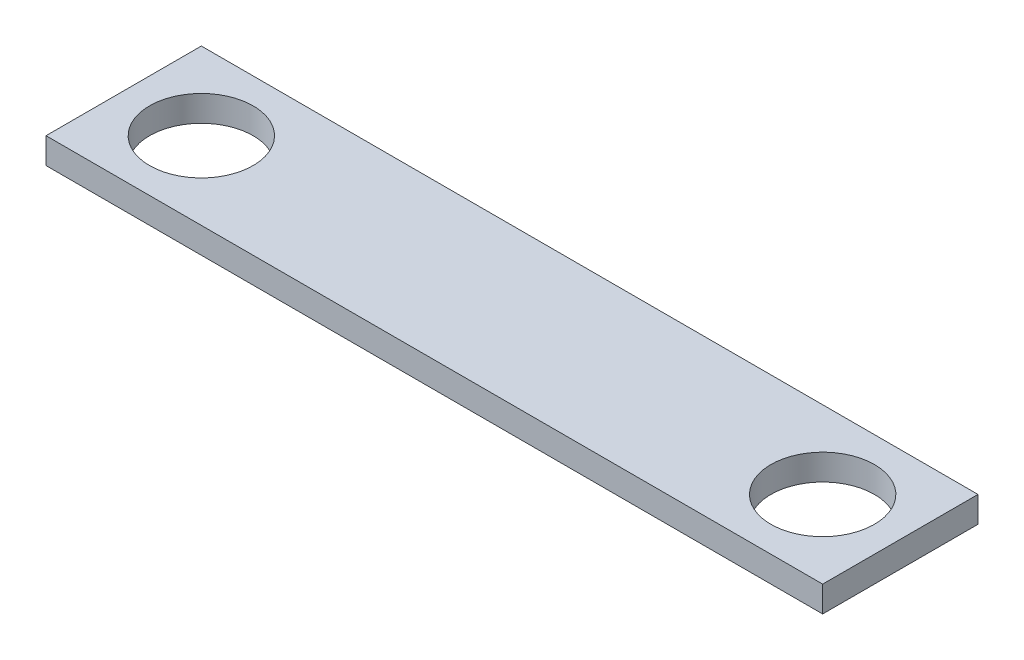
ISO-10303-21;
HEADER;
FILE_DESCRIPTION(('STEP AP214'),'2;1');
FILE_NAME('part.step','',(''),(''),'','','');
FILE_SCHEMA(('AUTOMOTIVE_DESIGN { 1 0 10303 214 1 1 1 1 }'));
ENDSEC;
DATA;
#1=APPLICATION_CONTEXT('core data for automotive mechanical design processes');
#2=APPLICATION_PROTOCOL_DEFINITION('international standard','automotive_design',2000,#1);
#3=PRODUCT_CONTEXT('',#1,'mechanical');
#4=PRODUCT('Part','Part','',(#3));
#5=PRODUCT_RELATED_PRODUCT_CATEGORY('part','',(#4));
#6=PRODUCT_DEFINITION_FORMATION('','',#4);
#7=PRODUCT_DEFINITION_CONTEXT('part definition',#1,'design');
#8=PRODUCT_DEFINITION('design','',#6,#7);
#9=PRODUCT_DEFINITION_SHAPE('','',#8);
#10=(LENGTH_UNIT() NAMED_UNIT(*) SI_UNIT(.MILLI.,.METRE.));
#11=(NAMED_UNIT(*) PLANE_ANGLE_UNIT() SI_UNIT($,.RADIAN.));
#12=(NAMED_UNIT(*) SI_UNIT($,.STERADIAN.) SOLID_ANGLE_UNIT());
#13=UNCERTAINTY_MEASURE_WITH_UNIT(LENGTH_MEASURE(1.E-05),#10,'distance_accuracy_value','');
#14=(GEOMETRIC_REPRESENTATION_CONTEXT(3) GLOBAL_UNCERTAINTY_ASSIGNED_CONTEXT((#13)) GLOBAL_UNIT_ASSIGNED_CONTEXT((#10,
#11,#12)) REPRESENTATION_CONTEXT('',''));
#15=CARTESIAN_POINT('',(0.,0.,0.));
#16=DIRECTION('',(0.,0.,1.));
#17=DIRECTION('',(1.,0.,0.));
#18=AXIS2_PLACEMENT_3D('',#15,#16,#17);
#19=CARTESIAN_POINT('',(0.,2.,0.));
#20=DIRECTION('',(0.,-1.,0.));
#21=DIRECTION('',(0.,0.,-1.));
#22=AXIS2_PLACEMENT_3D('',#19,#20,#21);
#23=PLANE('',#22);
#24=DIRECTION('',(0.,0.,1.));
#25=VECTOR('',#24,1.);
#26=CARTESIAN_POINT('',(0.,2.,0.));
#27=LINE('',#26,#25);
#28=CARTESIAN_POINT('',(0.,2.,-12.));
#29=VERTEX_POINT('',#28);
#30=CARTESIAN_POINT('',(0.,2.,0.));
#31=VERTEX_POINT('',#30);
#32=EDGE_CURVE('E92',#29,#31,#27,.T.);
#33=ORIENTED_EDGE('',*,*,#32,.T.);
#34=DIRECTION('',(1.,0.,0.));
#35=VECTOR('',#34,1.);
#36=CARTESIAN_POINT('',(0.,2.,0.));
#37=LINE('',#36,#35);
#38=CARTESIAN_POINT('',(60.,2.,0.));
#39=VERTEX_POINT('',#38);
#40=EDGE_CURVE('E87',#31,#39,#37,.T.);
#41=ORIENTED_EDGE('',*,*,#40,.T.);
#42=DIRECTION('',(0.,0.,-1.));
#43=VECTOR('',#42,1.);
#44=CARTESIAN_POINT('',(60.,2.,0.));
#45=LINE('',#44,#43);
#46=CARTESIAN_POINT('',(60.,2.,-12.));
#47=VERTEX_POINT('',#46);
#48=EDGE_CURVE('E90',#39,#47,#45,.T.);
#49=ORIENTED_EDGE('',*,*,#48,.T.);
#50=DIRECTION('',(-1.,0.,0.));
#51=VECTOR('',#50,1.);
#52=CARTESIAN_POINT('',(0.,2.,-12.));
#53=LINE('',#52,#51);
#54=EDGE_CURVE('E57',#47,#29,#53,.T.);
#55=ORIENTED_EDGE('',*,*,#54,.T.);
#56=EDGE_LOOP('',(#33,#41,#49,#55));
#57=FACE_BOUND('',#56,.T.);
#58=CARTESIAN_POINT('',(54.,2.,-6.));
#59=DIRECTION('',(0.,-1.,0.));
#60=DIRECTION('',(0.,0.,-1.));
#61=AXIS2_PLACEMENT_3D('',#58,#59,#60);
#62=CIRCLE('',#61,4.);
#63=CARTESIAN_POINT('',(54.,2.,-10.));
#64=VERTEX_POINT('',#63);
#65=EDGE_CURVE('E134',#64,#64,#62,.T.);
#66=ORIENTED_EDGE('',*,*,#65,.T.);
#67=EDGE_LOOP('',(#66));
#68=FACE_BOUND('',#67,.T.);
#69=CARTESIAN_POINT('',(6.,2.,-6.));
#70=DIRECTION('',(0.,1.,0.));
#71=DIRECTION('',(0.,0.,1.));
#72=AXIS2_PLACEMENT_3D('',#69,#70,#71);
#73=CIRCLE('',#72,4.);
#74=CARTESIAN_POINT('',(6.,2.,-2.));
#75=VERTEX_POINT('',#74);
#76=EDGE_CURVE('E138',#75,#75,#73,.T.);
#77=ORIENTED_EDGE('',*,*,#76,.F.);
#78=EDGE_LOOP('',(#77));
#79=FACE_BOUND('',#78,.T.);
#80=ADVANCED_FACE('F39',(#57,#68,#79),#23,.F.);
#81=CARTESIAN_POINT('',(0.,0.,0.));
#82=DIRECTION('',(0.,-1.,0.));
#83=DIRECTION('',(0.,0.,-1.));
#84=AXIS2_PLACEMENT_3D('',#81,#82,#83);
#85=PLANE('',#84);
#86=CARTESIAN_POINT('',(54.,0.,-6.));
#87=DIRECTION('',(0.,-1.,0.));
#88=DIRECTION('',(0.,0.,-1.));
#89=AXIS2_PLACEMENT_3D('',#86,#87,#88);
#90=CIRCLE('',#89,4.);
#91=CARTESIAN_POINT('',(54.,0.,-10.));
#92=VERTEX_POINT('',#91);
#93=EDGE_CURVE('E130',#92,#92,#90,.T.);
#94=ORIENTED_EDGE('',*,*,#93,.F.);
#95=EDGE_LOOP('',(#94));
#96=FACE_BOUND('',#95,.T.);
#97=DIRECTION('',(0.,0.,1.));
#98=VECTOR('',#97,1.);
#99=CARTESIAN_POINT('',(0.,0.,0.));
#100=LINE('',#99,#98);
#101=CARTESIAN_POINT('',(0.,0.,-12.));
#102=VERTEX_POINT('',#101);
#103=CARTESIAN_POINT('',(0.,0.,0.));
#104=VERTEX_POINT('',#103);
#105=EDGE_CURVE('E108',#102,#104,#100,.T.);
#106=ORIENTED_EDGE('',*,*,#105,.F.);
#107=DIRECTION('',(-1.,0.,0.));
#108=VECTOR('',#107,1.);
#109=CARTESIAN_POINT('',(0.,0.,-12.));
#110=LINE('',#109,#108);
#111=CARTESIAN_POINT('',(60.,0.,-12.));
#112=VERTEX_POINT('',#111);
#113=EDGE_CURVE('E80',#112,#102,#110,.T.);
#114=ORIENTED_EDGE('',*,*,#113,.F.);
#115=DIRECTION('',(0.,0.,-1.));
#116=VECTOR('',#115,1.);
#117=CARTESIAN_POINT('',(60.,0.,0.));
#118=LINE('',#117,#116);
#119=CARTESIAN_POINT('',(60.,0.,0.));
#120=VERTEX_POINT('',#119);
#121=EDGE_CURVE('E74',#120,#112,#118,.T.);
#122=ORIENTED_EDGE('',*,*,#121,.F.);
#123=DIRECTION('',(1.,0.,0.));
#124=VECTOR('',#123,1.);
#125=CARTESIAN_POINT('',(0.,0.,0.));
#126=LINE('',#125,#124);
#127=EDGE_CURVE('E97',#104,#120,#126,.T.);
#128=ORIENTED_EDGE('',*,*,#127,.F.);
#129=EDGE_LOOP('',(#106,#114,#122,#128));
#130=FACE_BOUND('',#129,.T.);
#131=CARTESIAN_POINT('',(6.,0.,-6.));
#132=DIRECTION('',(0.,1.,0.));
#133=DIRECTION('',(0.,0.,1.));
#134=AXIS2_PLACEMENT_3D('',#131,#132,#133);
#135=CIRCLE('',#134,4.);
#136=CARTESIAN_POINT('',(6.,0.,-2.));
#137=VERTEX_POINT('',#136);
#138=EDGE_CURVE('E112',#137,#137,#135,.T.);
#139=ORIENTED_EDGE('',*,*,#138,.T.);
#140=EDGE_LOOP('',(#139));
#141=FACE_BOUND('',#140,.T.);
#142=ADVANCED_FACE('F125',(#96,#130,#141),#85,.T.);
#143=CARTESIAN_POINT('',(0.,2.,0.));
#144=DIRECTION('',(1.,0.,0.));
#145=DIRECTION('',(0.,0.,-1.));
#146=AXIS2_PLACEMENT_3D('',#143,#144,#145);
#147=PLANE('',#146);
#148=ORIENTED_EDGE('',*,*,#105,.T.);
#149=DIRECTION('',(0.,-1.,0.));
#150=VECTOR('',#149,1.);
#151=CARTESIAN_POINT('',(0.,2.,0.));
#152=LINE('',#151,#150);
#153=EDGE_CURVE('E11',#31,#104,#152,.T.);
#154=ORIENTED_EDGE('',*,*,#153,.F.);
#155=ORIENTED_EDGE('',*,*,#32,.F.);
#156=DIRECTION('',(0.,-1.,0.));
#157=VECTOR('',#156,1.);
#158=CARTESIAN_POINT('',(0.,2.,-12.));
#159=LINE('',#158,#157);
#160=EDGE_CURVE('E104',#29,#102,#159,.T.);
#161=ORIENTED_EDGE('',*,*,#160,.T.);
#162=EDGE_LOOP('',(#148,#154,#155,#161));
#163=FACE_BOUND('',#162,.T.);
#164=ADVANCED_FACE('F41',(#163),#147,.F.);
#165=CARTESIAN_POINT('',(0.,2.,0.));
#166=DIRECTION('',(0.,0.,-1.));
#167=DIRECTION('',(-1.,0.,0.));
#168=AXIS2_PLACEMENT_3D('',#165,#166,#167);
#169=PLANE('',#168);
#170=ORIENTED_EDGE('',*,*,#127,.T.);
#171=DIRECTION('',(0.,-1.,0.));
#172=VECTOR('',#171,1.);
#173=CARTESIAN_POINT('',(60.,2.,0.));
#174=LINE('',#173,#172);
#175=EDGE_CURVE('E49',#39,#120,#174,.T.);
#176=ORIENTED_EDGE('',*,*,#175,.F.);
#177=ORIENTED_EDGE('',*,*,#40,.F.);
#178=ORIENTED_EDGE('',*,*,#153,.T.);
#179=EDGE_LOOP('',(#170,#176,#177,#178));
#180=FACE_BOUND('',#179,.T.);
#181=ADVANCED_FACE('F96',(#180),#169,.F.);
#182=CARTESIAN_POINT('',(60.,2.,0.));
#183=DIRECTION('',(-1.,0.,0.));
#184=DIRECTION('',(0.,0.,1.));
#185=AXIS2_PLACEMENT_3D('',#182,#183,#184);
#186=PLANE('',#185);
#187=ORIENTED_EDGE('',*,*,#121,.T.);
#188=DIRECTION('',(0.,-1.,0.));
#189=VECTOR('',#188,1.);
#190=CARTESIAN_POINT('',(60.,2.,-12.));
#191=LINE('',#190,#189);
#192=EDGE_CURVE('E99',#47,#112,#191,.T.);
#193=ORIENTED_EDGE('',*,*,#192,.F.);
#194=ORIENTED_EDGE('',*,*,#48,.F.);
#195=ORIENTED_EDGE('',*,*,#175,.T.);
#196=EDGE_LOOP('',(#187,#193,#194,#195));
#197=FACE_BOUND('',#196,.T.);
#198=ADVANCED_FACE('F100',(#197),#186,.F.);
#199=CARTESIAN_POINT('',(0.,2.,-12.));
#200=DIRECTION('',(0.,0.,1.));
#201=DIRECTION('',(1.,0.,0.));
#202=AXIS2_PLACEMENT_3D('',#199,#200,#201);
#203=PLANE('',#202);
#204=ORIENTED_EDGE('',*,*,#113,.T.);
#205=ORIENTED_EDGE('',*,*,#160,.F.);
#206=ORIENTED_EDGE('',*,*,#54,.F.);
#207=ORIENTED_EDGE('',*,*,#192,.T.);
#208=EDGE_LOOP('',(#204,#205,#206,#207));
#209=FACE_BOUND('',#208,.T.);
#210=ADVANCED_FACE('F122',(#209),#203,.F.);
#211=CARTESIAN_POINT('',(54.,0.,-6.));
#212=DIRECTION('',(0.,1.,0.));
#213=DIRECTION('',(0.,0.,1.));
#214=AXIS2_PLACEMENT_3D('',#211,#212,#213);
#215=CYLINDRICAL_SURFACE('',#214,4.);
#216=ORIENTED_EDGE('',*,*,#93,.T.);
#217=EDGE_LOOP('',(#216));
#218=FACE_BOUND('',#217,.T.);
#219=ORIENTED_EDGE('',*,*,#65,.F.);
#220=EDGE_LOOP('',(#219));
#221=FACE_BOUND('',#220,.T.);
#222=ADVANCED_FACE('F149',(#218,#221),#215,.F.);
#223=CARTESIAN_POINT('',(6.,0.,-6.));
#224=DIRECTION('',(0.,1.,0.));
#225=DIRECTION('',(0.,0.,1.));
#226=AXIS2_PLACEMENT_3D('',#223,#224,#225);
#227=CYLINDRICAL_SURFACE('',#226,4.);
#228=ORIENTED_EDGE('',*,*,#138,.F.);
#229=EDGE_LOOP('',(#228));
#230=FACE_BOUND('',#229,.T.);
#231=ORIENTED_EDGE('',*,*,#76,.T.);
#232=EDGE_LOOP('',(#231));
#233=FACE_BOUND('',#232,.T.);
#234=ADVANCED_FACE('F146',(#230,#233),#227,.F.);
#235=CLOSED_SHELL('',(#80,#142,#164,#181,#198,#210,#222,#234));
#236=MANIFOLD_SOLID_BREP('B2',#235);
#237=ADVANCED_BREP_SHAPE_REPRESENTATION('',(#18,#236),#14);
#238=SHAPE_DEFINITION_REPRESENTATION(#9,#237);
ENDSEC;
END-ISO-10303-21;
